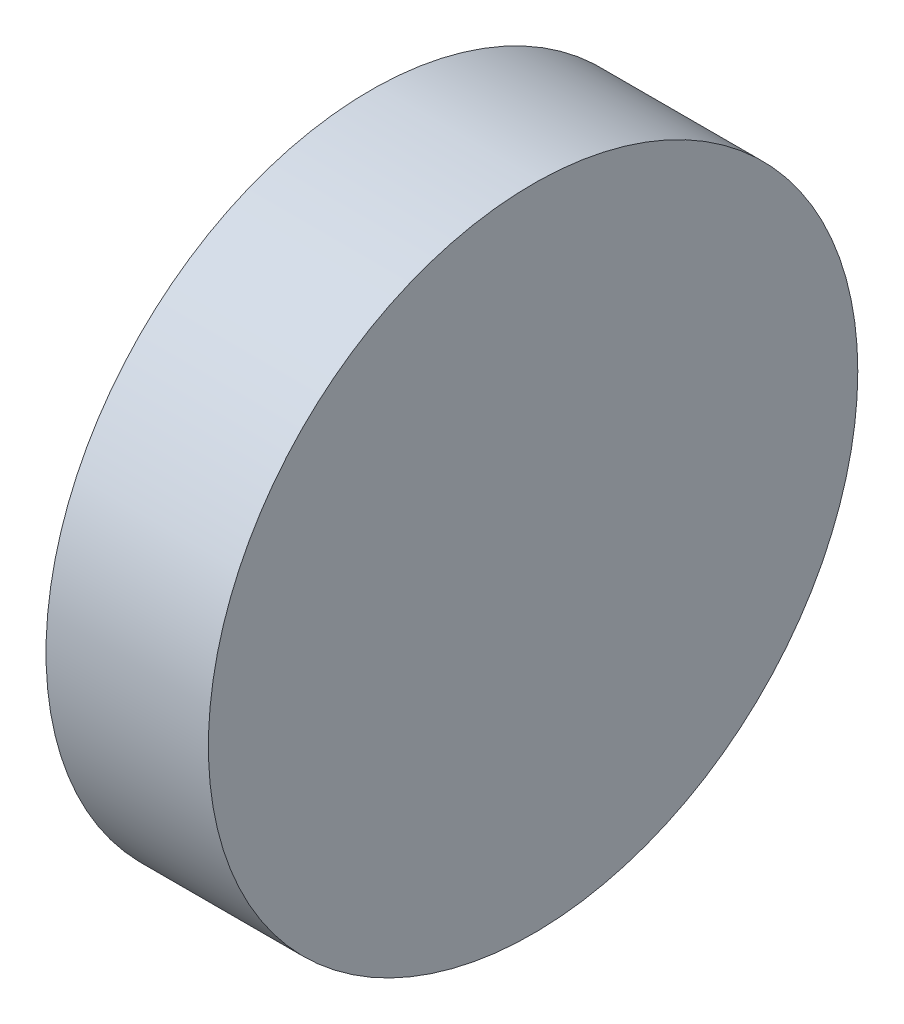
ISO-10303-21;
HEADER;
FILE_DESCRIPTION(('STEP AP214'),'2;1');
FILE_NAME('part.step','',(''),(''),'','','');
FILE_SCHEMA(('AUTOMOTIVE_DESIGN { 1 0 10303 214 1 1 1 1 }'));
ENDSEC;
DATA;
#1=APPLICATION_CONTEXT('core data for automotive mechanical design processes');
#2=APPLICATION_PROTOCOL_DEFINITION('international standard','automotive_design',2000,#1);
#3=PRODUCT_CONTEXT('',#1,'mechanical');
#4=PRODUCT('Part','Part','',(#3));
#5=PRODUCT_RELATED_PRODUCT_CATEGORY('part','',(#4));
#6=PRODUCT_DEFINITION_FORMATION('','',#4);
#7=PRODUCT_DEFINITION_CONTEXT('part definition',#1,'design');
#8=PRODUCT_DEFINITION('design','',#6,#7);
#9=PRODUCT_DEFINITION_SHAPE('','',#8);
#10=(LENGTH_UNIT() NAMED_UNIT(*) SI_UNIT(.MILLI.,.METRE.));
#11=(NAMED_UNIT(*) PLANE_ANGLE_UNIT() SI_UNIT($,.RADIAN.));
#12=(NAMED_UNIT(*) SI_UNIT($,.STERADIAN.) SOLID_ANGLE_UNIT());
#13=UNCERTAINTY_MEASURE_WITH_UNIT(LENGTH_MEASURE(1.E-05),#10,'distance_accuracy_value','');
#14=(GEOMETRIC_REPRESENTATION_CONTEXT(3) GLOBAL_UNCERTAINTY_ASSIGNED_CONTEXT((#13)) GLOBAL_UNIT_ASSIGNED_CONTEXT((#10,
#11,#12)) REPRESENTATION_CONTEXT('',''));
#15=CARTESIAN_POINT('',(0.,0.,0.));
#16=DIRECTION('',(0.,0.,1.));
#17=DIRECTION('',(1.,0.,0.));
#18=AXIS2_PLACEMENT_3D('',#15,#16,#17);
#19=CARTESIAN_POINT('',(100.,0.,0.));
#20=DIRECTION('',(-1.,0.,0.));
#21=DIRECTION('',(0.,0.,1.));
#22=AXIS2_PLACEMENT_3D('',#19,#20,#21);
#23=CYLINDRICAL_SURFACE('',#22,200.);
#24=CARTESIAN_POINT('',(100.,0.,0.));
#25=DIRECTION('',(1.,0.,0.));
#26=DIRECTION('',(0.,0.,-1.));
#27=AXIS2_PLACEMENT_3D('',#24,#25,#26);
#28=CIRCLE('',#27,200.);
#29=CARTESIAN_POINT('',(100.,0.,-200.));
#30=VERTEX_POINT('',#29);
#31=EDGE_CURVE('E10',#30,#30,#28,.T.);
#32=ORIENTED_EDGE('',*,*,#31,.F.);
#33=EDGE_LOOP('',(#32));
#34=FACE_BOUND('',#33,.T.);
#35=CARTESIAN_POINT('',(0.,0.,0.));
#36=DIRECTION('',(1.,0.,0.));
#37=DIRECTION('',(0.,0.,-1.));
#38=AXIS2_PLACEMENT_3D('',#35,#36,#37);
#39=CIRCLE('',#38,200.);
#40=CARTESIAN_POINT('',(0.,0.,-200.));
#41=VERTEX_POINT('',#40);
#42=EDGE_CURVE('E44',#41,#41,#39,.T.);
#43=ORIENTED_EDGE('',*,*,#42,.T.);
#44=EDGE_LOOP('',(#43));
#45=FACE_BOUND('',#44,.T.);
#46=ADVANCED_FACE('F41',(#34,#45),#23,.T.);
#47=CARTESIAN_POINT('',(100.,0.,0.));
#48=DIRECTION('',(1.,0.,0.));
#49=DIRECTION('',(0.,0.,-1.));
#50=AXIS2_PLACEMENT_3D('',#47,#48,#49);
#51=PLANE('',#50);
#52=ORIENTED_EDGE('',*,*,#31,.T.);
#53=EDGE_LOOP('',(#52));
#54=FACE_BOUND('',#53,.T.);
#55=ADVANCED_FACE('F58',(#54),#51,.T.);
#56=CARTESIAN_POINT('',(0.,0.,0.));
#57=DIRECTION('',(1.,0.,0.));
#58=DIRECTION('',(0.,0.,-1.));
#59=AXIS2_PLACEMENT_3D('',#56,#57,#58);
#60=PLANE('',#59);
#61=ORIENTED_EDGE('',*,*,#42,.F.);
#62=EDGE_LOOP('',(#61));
#63=FACE_BOUND('',#62,.T.);
#64=ADVANCED_FACE('F56',(#63),#60,.F.);
#65=CLOSED_SHELL('',(#46,#55,#64));
#66=MANIFOLD_SOLID_BREP('B2',#65);
#67=ADVANCED_BREP_SHAPE_REPRESENTATION('',(#18,#66),#14);
#68=SHAPE_DEFINITION_REPRESENTATION(#9,#67);
ENDSEC;
END-ISO-10303-21;
